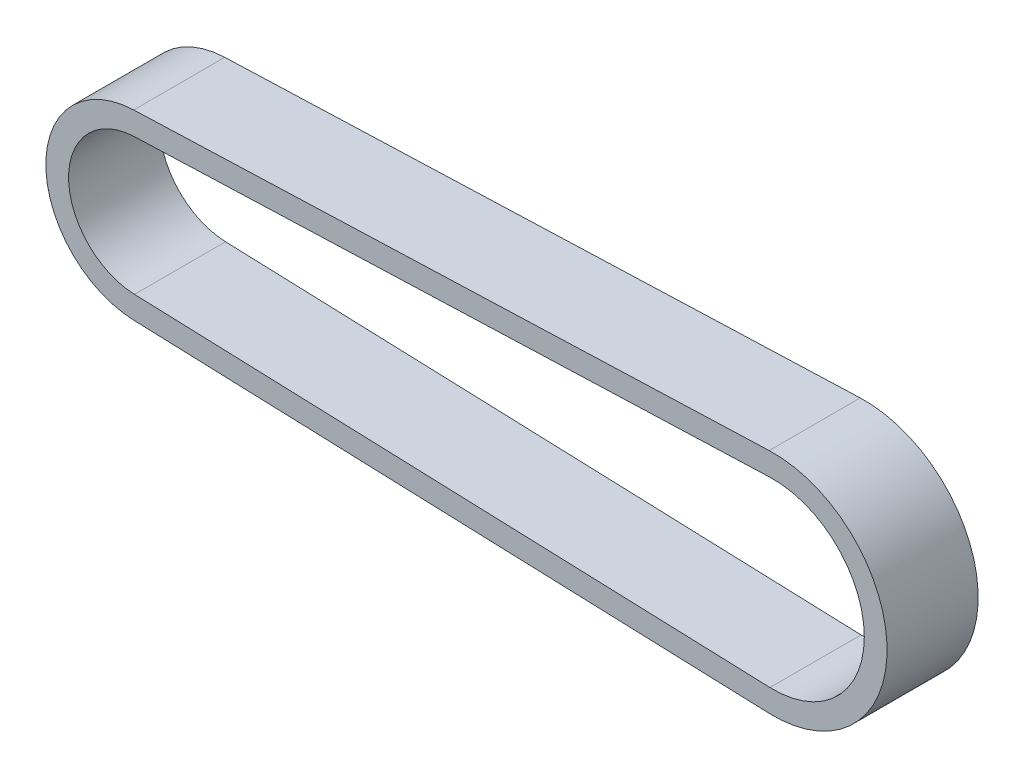
ISO-10303-21;
HEADER;
FILE_DESCRIPTION(('STEP AP214'),'2;1');
FILE_NAME('part.step','',(''),(''),'','','');
FILE_SCHEMA(('AUTOMOTIVE_DESIGN { 1 0 10303 214 1 1 1 1 }'));
ENDSEC;
DATA;
#1=APPLICATION_CONTEXT('core data for automotive mechanical design processes');
#2=APPLICATION_PROTOCOL_DEFINITION('international standard','automotive_design',2000,#1);
#3=PRODUCT_CONTEXT('',#1,'mechanical');
#4=PRODUCT('Part','Part','',(#3));
#5=PRODUCT_RELATED_PRODUCT_CATEGORY('part','',(#4));
#6=PRODUCT_DEFINITION_FORMATION('','',#4);
#7=PRODUCT_DEFINITION_CONTEXT('part definition',#1,'design');
#8=PRODUCT_DEFINITION('design','',#6,#7);
#9=PRODUCT_DEFINITION_SHAPE('','',#8);
#10=(LENGTH_UNIT() NAMED_UNIT(*) SI_UNIT(.MILLI.,.METRE.));
#11=(NAMED_UNIT(*) PLANE_ANGLE_UNIT() SI_UNIT($,.RADIAN.));
#12=(NAMED_UNIT(*) SI_UNIT($,.STERADIAN.) SOLID_ANGLE_UNIT());
#13=UNCERTAINTY_MEASURE_WITH_UNIT(LENGTH_MEASURE(1.E-05),#10,'distance_accuracy_value','');
#14=(GEOMETRIC_REPRESENTATION_CONTEXT(3) GLOBAL_UNCERTAINTY_ASSIGNED_CONTEXT((#13)) GLOBAL_UNIT_ASSIGNED_CONTEXT((#10,
#11,#12)) REPRESENTATION_CONTEXT('',''));
#15=CARTESIAN_POINT('',(0.,0.,0.));
#16=DIRECTION('',(0.,0.,1.));
#17=DIRECTION('',(1.,0.,0.));
#18=AXIS2_PLACEMENT_3D('',#15,#16,#17);
#19=CARTESIAN_POINT('',(-20.7486946764916,-5.74631578454645,3.));
#20=DIRECTION('',(0.,0.,1.));
#21=DIRECTION('',(1.,0.,0.));
#22=AXIS2_PLACEMENT_3D('',#19,#20,#21);
#23=PLANE('',#22);
#24=CARTESIAN_POINT('',(-20.7486946764916,-5.74631578454645,3.));
#25=DIRECTION('',(0.,0.,1.));
#26=DIRECTION('',(1.,0.,0.));
#27=AXIS2_PLACEMENT_3D('',#24,#25,#26);
#28=CIRCLE('',#27,6.);
#29=CARTESIAN_POINT('',(-20.963445707707,0.249839816719411,3.));
#30=VERTEX_POINT('',#29);
#31=CARTESIAN_POINT('',(-20.963445707707,-11.7424713858123,3.));
#32=VERTEX_POINT('',#31);
#33=EDGE_CURVE('E158',#30,#32,#28,.T.);
#34=ORIENTED_EDGE('',*,*,#33,.T.);
#35=DIRECTION('',(0.999359266877643,-0.0357918385359043,0.));
#36=VECTOR('',#35,1.);
#37=CARTESIAN_POINT('',(-20.963445707707,-11.7424713858123,3.));
#38=LINE('',#37,#36);
#39=CARTESIAN_POINT('',(20.8918620306352,-13.2415102861288,3.));
#40=VERTEX_POINT('',#39);
#41=EDGE_CURVE('E161',#32,#40,#38,.T.);
#42=ORIENTED_EDGE('',*,*,#41,.T.);
#43=CARTESIAN_POINT('',(21.1603008196545,-5.74631578454645,3.));
#44=DIRECTION('',(0.,0.,1.));
#45=DIRECTION('',(1.,0.,0.));
#46=AXIS2_PLACEMENT_3D('',#43,#44,#45);
#47=CIRCLE('',#46,7.5);
#48=CARTESIAN_POINT('',(20.8918620306352,1.74887871703587,3.));
#49=VERTEX_POINT('',#48);
#50=EDGE_CURVE('E164',#40,#49,#47,.T.);
#51=ORIENTED_EDGE('',*,*,#50,.T.);
#52=DIRECTION('',(-0.999359266877643,-0.0357918385359043,0.));
#53=VECTOR('',#52,1.);
#54=CARTESIAN_POINT('',(20.8918620306352,1.74887871703587,3.));
#55=LINE('',#54,#53);
#56=EDGE_CURVE('E166',#49,#30,#55,.T.);
#57=ORIENTED_EDGE('',*,*,#56,.T.);
#58=EDGE_LOOP('',(#34,#42,#51,#57));
#59=FACE_BOUND('',#58,.T.);
#60=DIRECTION('',(0.999359266877643,-0.0357918385359043,0.));
#61=VECTOR('',#60,1.);
#62=CARTESIAN_POINT('',(-20.9097579499032,-10.2434324854958,3.));
#63=LINE('',#62,#61);
#64=CARTESIAN_POINT('',(-20.9097579499032,-10.2434324854958,3.));
#65=VERTEX_POINT('',#64);
#66=CARTESIAN_POINT('',(20.9455497884391,-11.7424713858123,3.));
#67=VERTEX_POINT('',#66);
#68=EDGE_CURVE('E130',#65,#67,#63,.T.);
#69=ORIENTED_EDGE('',*,*,#68,.F.);
#70=CARTESIAN_POINT('',(-20.7486946764916,-5.74631578454645,3.));
#71=DIRECTION('',(0.,0.,1.));
#72=DIRECTION('',(1.,0.,0.));
#73=AXIS2_PLACEMENT_3D('',#70,#71,#72);
#74=CIRCLE('',#73,4.5);
#75=CARTESIAN_POINT('',(-20.9097579499032,-1.24919908359705,3.));
#76=VERTEX_POINT('',#75);
#77=EDGE_CURVE('E122',#76,#65,#74,.T.);
#78=ORIENTED_EDGE('',*,*,#77,.F.);
#79=DIRECTION('',(-0.999359266877643,-0.0357918385359043,0.));
#80=VECTOR('',#79,1.);
#81=CARTESIAN_POINT('',(20.9455497884391,0.24983981671941,3.));
#82=LINE('',#81,#80);
#83=CARTESIAN_POINT('',(20.9455497884391,0.24983981671941,3.));
#84=VERTEX_POINT('',#83);
#85=EDGE_CURVE('E144',#84,#76,#82,.T.);
#86=ORIENTED_EDGE('',*,*,#85,.F.);
#87=CARTESIAN_POINT('',(21.1603008196545,-5.74631578454645,3.));
#88=DIRECTION('',(0.,0.,1.));
#89=DIRECTION('',(1.,0.,0.));
#90=AXIS2_PLACEMENT_3D('',#87,#88,#89);
#91=CIRCLE('',#90,6.);
#92=EDGE_CURVE('E142',#67,#84,#91,.T.);
#93=ORIENTED_EDGE('',*,*,#92,.F.);
#94=EDGE_LOOP('',(#69,#78,#86,#93));
#95=FACE_BOUND('',#94,.T.);
#96=ADVANCED_FACE('F57',(#59,#95),#23,.T.);
#97=CARTESIAN_POINT('',(-20.7486946764916,-5.74631578454645,-3.));
#98=DIRECTION('',(0.,0.,1.));
#99=DIRECTION('',(1.,0.,0.));
#100=AXIS2_PLACEMENT_3D('',#97,#98,#99);
#101=PLANE('',#100);
#102=CARTESIAN_POINT('',(-20.7486946764916,-5.74631578454645,-3.));
#103=DIRECTION('',(0.,0.,1.));
#104=DIRECTION('',(1.,0.,0.));
#105=AXIS2_PLACEMENT_3D('',#102,#103,#104);
#106=CIRCLE('',#105,6.);
#107=CARTESIAN_POINT('',(-20.963445707707,0.249839816719411,-3.));
#108=VERTEX_POINT('',#107);
#109=CARTESIAN_POINT('',(-20.963445707707,-11.7424713858123,-3.));
#110=VERTEX_POINT('',#109);
#111=EDGE_CURVE('E138',#108,#110,#106,.T.);
#112=ORIENTED_EDGE('',*,*,#111,.F.);
#113=DIRECTION('',(-0.999359266877643,-0.0357918385359043,0.));
#114=VECTOR('',#113,1.);
#115=CARTESIAN_POINT('',(20.8918620306352,1.74887871703587,-3.));
#116=LINE('',#115,#114);
#117=CARTESIAN_POINT('',(20.8918620306352,1.74887871703587,-3.));
#118=VERTEX_POINT('',#117);
#119=EDGE_CURVE('E162',#118,#108,#116,.T.);
#120=ORIENTED_EDGE('',*,*,#119,.F.);
#121=CARTESIAN_POINT('',(21.1603008196545,-5.74631578454645,-3.));
#122=DIRECTION('',(0.,0.,1.));
#123=DIRECTION('',(1.,0.,0.));
#124=AXIS2_PLACEMENT_3D('',#121,#122,#123);
#125=CIRCLE('',#124,7.5);
#126=CARTESIAN_POINT('',(20.8918620306352,-13.2415102861288,-3.));
#127=VERTEX_POINT('',#126);
#128=EDGE_CURVE('E173',#127,#118,#125,.T.);
#129=ORIENTED_EDGE('',*,*,#128,.F.);
#130=DIRECTION('',(0.999359266877643,-0.0357918385359043,0.));
#131=VECTOR('',#130,1.);
#132=CARTESIAN_POINT('',(-20.963445707707,-11.7424713858123,-3.));
#133=LINE('',#132,#131);
#134=EDGE_CURVE('E171',#110,#127,#133,.T.);
#135=ORIENTED_EDGE('',*,*,#134,.F.);
#136=EDGE_LOOP('',(#112,#120,#129,#135));
#137=FACE_BOUND('',#136,.T.);
#138=CARTESIAN_POINT('',(-20.7486946764916,-5.74631578454645,-3.));
#139=DIRECTION('',(0.,0.,1.));
#140=DIRECTION('',(1.,0.,0.));
#141=AXIS2_PLACEMENT_3D('',#138,#139,#140);
#142=CIRCLE('',#141,4.5);
#143=CARTESIAN_POINT('',(-20.9097579499032,-1.24919908359705,-3.));
#144=VERTEX_POINT('',#143);
#145=CARTESIAN_POINT('',(-20.9097579499032,-10.2434324854958,-3.));
#146=VERTEX_POINT('',#145);
#147=EDGE_CURVE('E80',#144,#146,#142,.T.);
#148=ORIENTED_EDGE('',*,*,#147,.T.);
#149=DIRECTION('',(0.999359266877643,-0.0357918385359043,0.));
#150=VECTOR('',#149,1.);
#151=CARTESIAN_POINT('',(-20.9097579499032,-10.2434324854958,-3.));
#152=LINE('',#151,#150);
#153=CARTESIAN_POINT('',(20.9455497884391,-11.7424713858123,-3.));
#154=VERTEX_POINT('',#153);
#155=EDGE_CURVE('E137',#146,#154,#152,.T.);
#156=ORIENTED_EDGE('',*,*,#155,.T.);
#157=CARTESIAN_POINT('',(21.1603008196545,-5.74631578454645,-3.));
#158=DIRECTION('',(0.,0.,1.));
#159=DIRECTION('',(1.,0.,0.));
#160=AXIS2_PLACEMENT_3D('',#157,#158,#159);
#161=CIRCLE('',#160,6.);
#162=CARTESIAN_POINT('',(20.9455497884391,0.249839816719408,-3.));
#163=VERTEX_POINT('',#162);
#164=EDGE_CURVE('E150',#154,#163,#161,.T.);
#165=ORIENTED_EDGE('',*,*,#164,.T.);
#166=DIRECTION('',(-0.999359266877643,-0.0357918385359043,0.));
#167=VECTOR('',#166,1.);
#168=CARTESIAN_POINT('',(20.9455497884391,0.24983981671941,-3.));
#169=LINE('',#168,#167);
#170=EDGE_CURVE('E131',#163,#144,#169,.T.);
#171=ORIENTED_EDGE('',*,*,#170,.T.);
#172=EDGE_LOOP('',(#148,#156,#165,#171));
#173=FACE_BOUND('',#172,.T.);
#174=ADVANCED_FACE('F191',(#137,#173),#101,.F.);
#175=CARTESIAN_POINT('',(-20.7486946764916,-5.74631578454645,3.));
#176=DIRECTION('',(0.,0.,-1.));
#177=DIRECTION('',(-1.,0.,0.));
#178=AXIS2_PLACEMENT_3D('',#175,#176,#177);
#179=CYLINDRICAL_SURFACE('',#178,6.);
#180=ORIENTED_EDGE('',*,*,#111,.T.);
#181=DIRECTION('',(0.,0.,-1.));
#182=VECTOR('',#181,1.);
#183=CARTESIAN_POINT('',(-20.963445707707,-11.7424713858123,3.));
#184=LINE('',#183,#182);
#185=EDGE_CURVE('E12',#32,#110,#184,.T.);
#186=ORIENTED_EDGE('',*,*,#185,.F.);
#187=ORIENTED_EDGE('',*,*,#33,.F.);
#188=DIRECTION('',(0.,0.,-1.));
#189=VECTOR('',#188,1.);
#190=CARTESIAN_POINT('',(-20.963445707707,0.249839816719411,3.));
#191=LINE('',#190,#189);
#192=EDGE_CURVE('E168',#30,#108,#191,.T.);
#193=ORIENTED_EDGE('',*,*,#192,.T.);
#194=EDGE_LOOP('',(#180,#186,#187,#193));
#195=FACE_BOUND('',#194,.T.);
#196=ADVANCED_FACE('F59',(#195),#179,.T.);
#197=CARTESIAN_POINT('',(-20.963445707707,-11.7424713858123,3.));
#198=DIRECTION('',(0.0357918385359043,0.999359266877643,0.));
#199=DIRECTION('',(-0.999359266877643,0.0357918385359043,0.));
#200=AXIS2_PLACEMENT_3D('',#197,#198,#199);
#201=PLANE('',#200);
#202=ORIENTED_EDGE('',*,*,#134,.T.);
#203=DIRECTION('',(0.,0.,-1.));
#204=VECTOR('',#203,1.);
#205=CARTESIAN_POINT('',(20.8918620306352,-13.2415102861288,3.));
#206=LINE('',#205,#204);
#207=EDGE_CURVE('E65',#40,#127,#206,.T.);
#208=ORIENTED_EDGE('',*,*,#207,.F.);
#209=ORIENTED_EDGE('',*,*,#41,.F.);
#210=ORIENTED_EDGE('',*,*,#185,.T.);
#211=EDGE_LOOP('',(#202,#208,#209,#210));
#212=FACE_BOUND('',#211,.T.);
#213=ADVANCED_FACE('F201',(#212),#201,.F.);
#214=CARTESIAN_POINT('',(21.1603008196545,-5.74631578454645,3.));
#215=DIRECTION('',(0.,0.,-1.));
#216=DIRECTION('',(-1.,0.,0.));
#217=AXIS2_PLACEMENT_3D('',#214,#215,#216);
#218=CYLINDRICAL_SURFACE('',#217,7.5);
#219=ORIENTED_EDGE('',*,*,#128,.T.);
#220=DIRECTION('',(0.,0.,-1.));
#221=VECTOR('',#220,1.);
#222=CARTESIAN_POINT('',(20.8918620306352,1.74887871703587,3.));
#223=LINE('',#222,#221);
#224=EDGE_CURVE('E178',#49,#118,#223,.T.);
#225=ORIENTED_EDGE('',*,*,#224,.F.);
#226=ORIENTED_EDGE('',*,*,#50,.F.);
#227=ORIENTED_EDGE('',*,*,#207,.T.);
#228=EDGE_LOOP('',(#219,#225,#226,#227));
#229=FACE_BOUND('',#228,.T.);
#230=ADVANCED_FACE('F185',(#229),#218,.T.);
#231=CARTESIAN_POINT('',(20.8918620306352,1.74887871703587,3.));
#232=DIRECTION('',(0.0357918385359043,-0.999359266877643,0.));
#233=DIRECTION('',(0.999359266877643,0.0357918385359043,0.));
#234=AXIS2_PLACEMENT_3D('',#231,#232,#233);
#235=PLANE('',#234);
#236=ORIENTED_EDGE('',*,*,#119,.T.);
#237=ORIENTED_EDGE('',*,*,#192,.F.);
#238=ORIENTED_EDGE('',*,*,#56,.F.);
#239=ORIENTED_EDGE('',*,*,#224,.T.);
#240=EDGE_LOOP('',(#236,#237,#238,#239));
#241=FACE_BOUND('',#240,.T.);
#242=ADVANCED_FACE('F195',(#241),#235,.F.);
#243=CARTESIAN_POINT('',(-20.7486946764916,-5.74631578454645,3.));
#244=DIRECTION('',(0.,0.,-1.));
#245=DIRECTION('',(-1.,0.,0.));
#246=AXIS2_PLACEMENT_3D('',#243,#244,#245);
#247=CYLINDRICAL_SURFACE('',#246,4.5);
#248=ORIENTED_EDGE('',*,*,#147,.F.);
#249=DIRECTION('',(0.,0.,-1.));
#250=VECTOR('',#249,1.);
#251=CARTESIAN_POINT('',(-20.9097579499032,-1.24919908359705,3.));
#252=LINE('',#251,#250);
#253=EDGE_CURVE('E126',#76,#144,#252,.T.);
#254=ORIENTED_EDGE('',*,*,#253,.F.);
#255=ORIENTED_EDGE('',*,*,#77,.T.);
#256=DIRECTION('',(0.,0.,-1.));
#257=VECTOR('',#256,1.);
#258=CARTESIAN_POINT('',(-20.9097579499032,-10.2434324854958,3.));
#259=LINE('',#258,#257);
#260=EDGE_CURVE('E125',#65,#146,#259,.T.);
#261=ORIENTED_EDGE('',*,*,#260,.T.);
#262=EDGE_LOOP('',(#248,#254,#255,#261));
#263=FACE_BOUND('',#262,.T.);
#264=ADVANCED_FACE('F124',(#263),#247,.F.);
#265=CARTESIAN_POINT('',(-20.9097579499032,-10.2434324854958,3.));
#266=DIRECTION('',(0.0357918385359043,0.999359266877643,0.));
#267=DIRECTION('',(-0.999359266877643,0.0357918385359043,0.));
#268=AXIS2_PLACEMENT_3D('',#265,#266,#267);
#269=PLANE('',#268);
#270=ORIENTED_EDGE('',*,*,#155,.F.);
#271=ORIENTED_EDGE('',*,*,#260,.F.);
#272=ORIENTED_EDGE('',*,*,#68,.T.);
#273=DIRECTION('',(0.,0.,-1.));
#274=VECTOR('',#273,1.);
#275=CARTESIAN_POINT('',(20.9455497884391,-11.7424713858123,3.));
#276=LINE('',#275,#274);
#277=EDGE_CURVE('E139',#67,#154,#276,.T.);
#278=ORIENTED_EDGE('',*,*,#277,.T.);
#279=EDGE_LOOP('',(#270,#271,#272,#278));
#280=FACE_BOUND('',#279,.T.);
#281=ADVANCED_FACE('F134',(#280),#269,.T.);
#282=CARTESIAN_POINT('',(21.1603008196545,-5.74631578454645,3.));
#283=DIRECTION('',(0.,0.,-1.));
#284=DIRECTION('',(-1.,0.,0.));
#285=AXIS2_PLACEMENT_3D('',#282,#283,#284);
#286=CYLINDRICAL_SURFACE('',#285,6.);
#287=ORIENTED_EDGE('',*,*,#164,.F.);
#288=ORIENTED_EDGE('',*,*,#277,.F.);
#289=ORIENTED_EDGE('',*,*,#92,.T.);
#290=DIRECTION('',(0.,0.,-1.));
#291=VECTOR('',#290,1.);
#292=CARTESIAN_POINT('',(20.9455497884391,0.249839816719408,3.));
#293=LINE('',#292,#291);
#294=EDGE_CURVE('E72',#84,#163,#293,.T.);
#295=ORIENTED_EDGE('',*,*,#294,.T.);
#296=EDGE_LOOP('',(#287,#288,#289,#295));
#297=FACE_BOUND('',#296,.T.);
#298=ADVANCED_FACE('F224',(#297),#286,.F.);
#299=CARTESIAN_POINT('',(20.9455497884391,0.24983981671941,3.));
#300=DIRECTION('',(0.0357918385359043,-0.999359266877643,0.));
#301=DIRECTION('',(0.999359266877643,0.0357918385359043,0.));
#302=AXIS2_PLACEMENT_3D('',#299,#300,#301);
#303=PLANE('',#302);
#304=ORIENTED_EDGE('',*,*,#170,.F.);
#305=ORIENTED_EDGE('',*,*,#294,.F.);
#306=ORIENTED_EDGE('',*,*,#85,.T.);
#307=ORIENTED_EDGE('',*,*,#253,.T.);
#308=EDGE_LOOP('',(#304,#305,#306,#307));
#309=FACE_BOUND('',#308,.T.);
#310=ADVANCED_FACE('F228',(#309),#303,.T.);
#311=CLOSED_SHELL('',(#96,#174,#196,#213,#230,#242,#264,#281,#298,#310));
#312=MANIFOLD_SOLID_BREP('B2',#311);
#313=ADVANCED_BREP_SHAPE_REPRESENTATION('',(#18,#312),#14);
#314=SHAPE_DEFINITION_REPRESENTATION(#9,#313);
ENDSEC;
END-ISO-10303-21;
